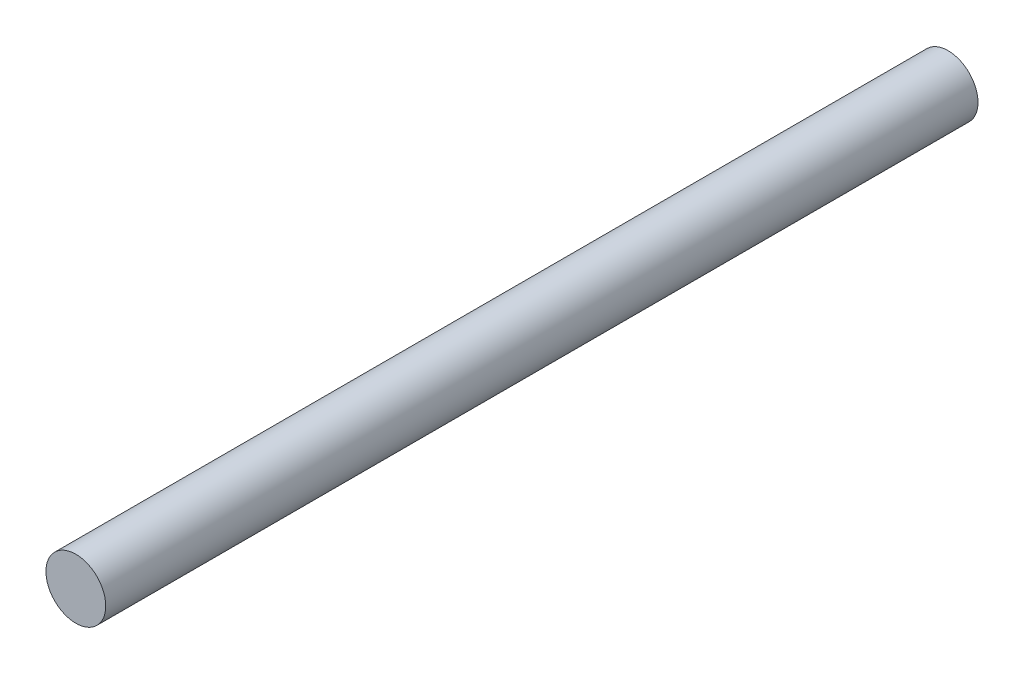
ISO-10303-21;
HEADER;
FILE_DESCRIPTION(('STEP AP214'),'2;1');
FILE_NAME('part.step','',(''),(''),'','','');
FILE_SCHEMA(('AUTOMOTIVE_DESIGN { 1 0 10303 214 1 1 1 1 }'));
ENDSEC;
DATA;
#1=APPLICATION_CONTEXT('core data for automotive mechanical design processes');
#2=APPLICATION_PROTOCOL_DEFINITION('international standard','automotive_design',2000,#1);
#3=PRODUCT_CONTEXT('',#1,'mechanical');
#4=PRODUCT('Part','Part','',(#3));
#5=PRODUCT_RELATED_PRODUCT_CATEGORY('part','',(#4));
#6=PRODUCT_DEFINITION_FORMATION('','',#4);
#7=PRODUCT_DEFINITION_CONTEXT('part definition',#1,'design');
#8=PRODUCT_DEFINITION('design','',#6,#7);
#9=PRODUCT_DEFINITION_SHAPE('','',#8);
#10=(LENGTH_UNIT() NAMED_UNIT(*) SI_UNIT(.MILLI.,.METRE.));
#11=(NAMED_UNIT(*) PLANE_ANGLE_UNIT() SI_UNIT($,.RADIAN.));
#12=(NAMED_UNIT(*) SI_UNIT($,.STERADIAN.) SOLID_ANGLE_UNIT());
#13=UNCERTAINTY_MEASURE_WITH_UNIT(LENGTH_MEASURE(1.E-05),#10,'distance_accuracy_value','');
#14=(GEOMETRIC_REPRESENTATION_CONTEXT(3) GLOBAL_UNCERTAINTY_ASSIGNED_CONTEXT((#13)) GLOBAL_UNIT_ASSIGNED_CONTEXT((#10,
#11,#12)) REPRESENTATION_CONTEXT('',''));
#15=CARTESIAN_POINT('',(0.,0.,0.));
#16=DIRECTION('',(0.,0.,1.));
#17=DIRECTION('',(1.,0.,0.));
#18=AXIS2_PLACEMENT_3D('',#15,#16,#17);
#19=CARTESIAN_POINT('',(0.,0.,175.));
#20=DIRECTION('',(0.,0.,-1.));
#21=DIRECTION('',(-1.,0.,0.));
#22=AXIS2_PLACEMENT_3D('',#19,#20,#21);
#23=CYLINDRICAL_SURFACE('',#22,6.);
#24=CARTESIAN_POINT('',(0.,0.,175.));
#25=DIRECTION('',(0.,0.,1.));
#26=DIRECTION('',(1.,0.,0.));
#27=AXIS2_PLACEMENT_3D('',#24,#25,#26);
#28=CIRCLE('',#27,6.);
#29=CARTESIAN_POINT('',(6.,0.,175.));
#30=VERTEX_POINT('',#29);
#31=EDGE_CURVE('E10',#30,#30,#28,.T.);
#32=ORIENTED_EDGE('',*,*,#31,.F.);
#33=EDGE_LOOP('',(#32));
#34=FACE_BOUND('',#33,.T.);
#35=CARTESIAN_POINT('',(0.,0.,0.));
#36=DIRECTION('',(0.,0.,1.));
#37=DIRECTION('',(1.,0.,0.));
#38=AXIS2_PLACEMENT_3D('',#35,#36,#37);
#39=CIRCLE('',#38,6.);
#40=CARTESIAN_POINT('',(6.,0.,0.));
#41=VERTEX_POINT('',#40);
#42=EDGE_CURVE('E34',#41,#41,#39,.T.);
#43=ORIENTED_EDGE('',*,*,#42,.T.);
#44=EDGE_LOOP('',(#43));
#45=FACE_BOUND('',#44,.T.);
#46=ADVANCED_FACE('F31',(#34,#45),#23,.T.);
#47=CARTESIAN_POINT('',(0.,0.,175.));
#48=DIRECTION('',(0.,0.,1.));
#49=DIRECTION('',(1.,0.,0.));
#50=AXIS2_PLACEMENT_3D('',#47,#48,#49);
#51=PLANE('',#50);
#52=ORIENTED_EDGE('',*,*,#31,.T.);
#53=EDGE_LOOP('',(#52));
#54=FACE_BOUND('',#53,.T.);
#55=ADVANCED_FACE('F46',(#54),#51,.T.);
#56=CARTESIAN_POINT('',(0.,0.,0.));
#57=DIRECTION('',(0.,0.,1.));
#58=DIRECTION('',(1.,0.,0.));
#59=AXIS2_PLACEMENT_3D('',#56,#57,#58);
#60=PLANE('',#59);
#61=ORIENTED_EDGE('',*,*,#42,.F.);
#62=EDGE_LOOP('',(#61));
#63=FACE_BOUND('',#62,.T.);
#64=ADVANCED_FACE('F44',(#63),#60,.F.);
#65=CLOSED_SHELL('',(#46,#55,#64));
#66=MANIFOLD_SOLID_BREP('B2',#65);
#67=ADVANCED_BREP_SHAPE_REPRESENTATION('',(#18,#66),#14);
#68=SHAPE_DEFINITION_REPRESENTATION(#9,#67);
ENDSEC;
END-ISO-10303-21;
